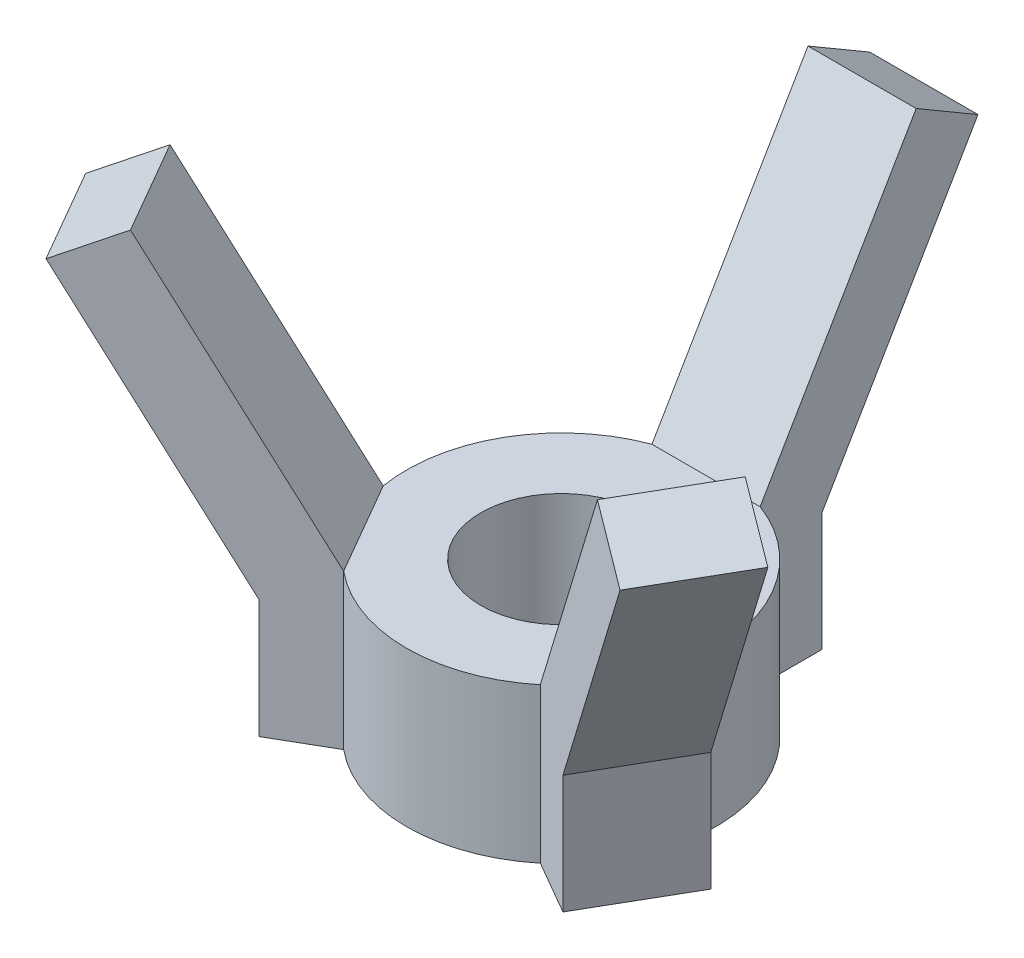
ISO-10303-21;
HEADER;
FILE_DESCRIPTION(('STEP AP214'),'2;1');
FILE_NAME('part.step','',(''),(''),'','','');
FILE_SCHEMA(('AUTOMOTIVE_DESIGN { 1 0 10303 214 1 1 1 1 }'));
ENDSEC;
DATA;
#1=APPLICATION_CONTEXT('core data for automotive mechanical design processes');
#2=APPLICATION_PROTOCOL_DEFINITION('international standard','automotive_design',2000,#1);
#3=PRODUCT_CONTEXT('',#1,'mechanical');
#4=PRODUCT('Part','Part','',(#3));
#5=PRODUCT_RELATED_PRODUCT_CATEGORY('part','',(#4));
#6=PRODUCT_DEFINITION_FORMATION('','',#4);
#7=PRODUCT_DEFINITION_CONTEXT('part definition',#1,'design');
#8=PRODUCT_DEFINITION('design','',#6,#7);
#9=PRODUCT_DEFINITION_SHAPE('','',#8);
#10=(LENGTH_UNIT() NAMED_UNIT(*) SI_UNIT(.MILLI.,.METRE.));
#11=(NAMED_UNIT(*) PLANE_ANGLE_UNIT() SI_UNIT($,.RADIAN.));
#12=(NAMED_UNIT(*) SI_UNIT($,.STERADIAN.) SOLID_ANGLE_UNIT());
#13=UNCERTAINTY_MEASURE_WITH_UNIT(LENGTH_MEASURE(1.E-05),#10,'distance_accuracy_value','');
#14=(GEOMETRIC_REPRESENTATION_CONTEXT(3) GLOBAL_UNCERTAINTY_ASSIGNED_CONTEXT((#13)) GLOBAL_UNIT_ASSIGNED_CONTEXT((#10,
#11,#12)) REPRESENTATION_CONTEXT('',''));
#15=CARTESIAN_POINT('',(0.,0.,0.));
#16=DIRECTION('',(0.,0.,1.));
#17=DIRECTION('',(1.,0.,0.));
#18=AXIS2_PLACEMENT_3D('',#15,#16,#17);
#19=CARTESIAN_POINT('',(0.,5.,0.));
#20=DIRECTION('',(0.,1.,0.));
#21=DIRECTION('',(0.,0.,1.));
#22=AXIS2_PLACEMENT_3D('',#19,#20,#21);
#23=PLANE('',#22);
#24=CARTESIAN_POINT('',(0.,5.,0.));
#25=DIRECTION('',(0.,1.,0.));
#26=DIRECTION('',(0.,0.,1.));
#27=AXIS2_PLACEMENT_3D('',#24,#25,#26);
#28=CIRCLE('',#27,2.6);
#29=CARTESIAN_POINT('',(0.,5.,2.6));
#30=VERTEX_POINT('',#29);
#31=EDGE_CURVE('E258',#30,#30,#28,.T.);
#32=ORIENTED_EDGE('',*,*,#31,.F.);
#33=EDGE_LOOP('',(#32));
#34=FACE_BOUND('',#33,.T.);
#35=CARTESIAN_POINT('',(0.,5.,0.));
#36=DIRECTION('',(0.,1.,0.));
#37=DIRECTION('',(0.,0.,1.));
#38=AXIS2_PLACEMENT_3D('',#35,#36,#37);
#39=CIRCLE('',#38,5.);
#40=CARTESIAN_POINT('',(-3.18124518489694,5.,3.85741870602221));
#41=VERTEX_POINT('',#40);
#42=CARTESIAN_POINT('',(3.18124518489694,5.,3.8574187060222));
#43=VERTEX_POINT('',#42);
#44=EDGE_CURVE('E261',#41,#43,#39,.T.);
#45=ORIENTED_EDGE('',*,*,#44,.T.);
#46=DIRECTION('',(0.499999999999995,0.,-0.866025403784441));
#47=VECTOR('',#46,1.);
#48=CARTESIAN_POINT('',(-2.85513684643813,5.,14.3127390781905));
#49=LINE('',#48,#47);
#50=CARTESIAN_POINT('',(4.931245184897,5.,0.826329792776546));
#51=VERTEX_POINT('',#50);
#52=EDGE_CURVE('E191',#43,#51,#49,.T.);
#53=ORIENTED_EDGE('',*,*,#52,.T.);
#54=CARTESIAN_POINT('',(0.,5.,0.));
#55=DIRECTION('',(0.,1.,0.));
#56=DIRECTION('',(0.,0.,1.));
#57=AXIS2_PLACEMENT_3D('',#54,#55,#56);
#58=CIRCLE('',#57,5.);
#59=CARTESIAN_POINT('',(1.75,5.,-4.6837484987988));
#60=VERTEX_POINT('',#59);
#61=EDGE_CURVE('E264',#51,#60,#58,.T.);
#62=ORIENTED_EDGE('',*,*,#61,.T.);
#63=DIRECTION('',(-1.,0.,0.));
#64=VECTOR('',#63,1.);
#65=CARTESIAN_POINT('',(13.8227640626703,5.,-4.68374849879892));
#66=LINE('',#65,#64);
#67=CARTESIAN_POINT('',(-1.7500000000001,5.,-4.68374849879876));
#68=VERTEX_POINT('',#67);
#69=EDGE_CURVE('E225',#60,#68,#66,.T.);
#70=ORIENTED_EDGE('',*,*,#69,.T.);
#71=CARTESIAN_POINT('',(0.,5.,0.));
#72=DIRECTION('',(0.,1.,0.));
#73=DIRECTION('',(0.,0.,1.));
#74=AXIS2_PLACEMENT_3D('',#71,#72,#73);
#75=CIRCLE('',#74,4.99999999999998);
#76=CARTESIAN_POINT('',(-4.93124518489694,5.,0.826329792776671));
#77=VERTEX_POINT('',#76);
#78=EDGE_CURVE('E267',#68,#77,#75,.T.);
#79=ORIENTED_EDGE('',*,*,#78,.T.);
#80=DIRECTION('',(0.500000000000001,0.,0.866025403784438));
#81=VECTOR('',#80,1.);
#82=CARTESIAN_POINT('',(-10.9676272162322,5.,-9.62899057939172));
#83=LINE('',#82,#81);
#84=EDGE_CURVE('E253',#77,#41,#83,.T.);
#85=ORIENTED_EDGE('',*,*,#84,.T.);
#86=EDGE_LOOP('',(#45,#53,#62,#70,#79,#85));
#87=FACE_BOUND('',#86,.T.);
#88=ADVANCED_FACE('F45',(#34,#87),#23,.T.);
#89=CARTESIAN_POINT('',(0.875000000000029,5.,1.51554445662282));
#90=DIRECTION('',(-0.500000000000001,0.,-0.866025403784438));
#91=DIRECTION('',(-0.866025403784438,0.,0.500000000000001));
#92=AXIS2_PLACEMENT_3D('',#89,#90,#91);
#93=PLANE('',#92);
#94=DIRECTION('',(0.437167436981779,-0.863237805816205,-0.252398737422369));
#95=VECTOR('',#94,1.);
#96=CARTESIAN_POINT('',(-9.2849703622836,12.4628336488612,7.3814060802459));
#97=LINE('',#96,#95);
#98=CARTESIAN_POINT('',(-9.2849703622836,12.4628336488612,7.3814060802459));
#99=VERTEX_POINT('',#98);
#100=CARTESIAN_POINT('',(-4.91329599246582,3.83045559069915,4.85741870602221));
#101=VERTEX_POINT('',#100);
#102=EDGE_CURVE('E231',#99,#101,#97,.T.);
#103=ORIENTED_EDGE('',*,*,#102,.T.);
#104=DIRECTION('',(0.,-1.,0.));
#105=VECTOR('',#104,1.);
#106=CARTESIAN_POINT('',(-4.91329599246582,5.,4.85741870602221));
#107=LINE('',#106,#105);
#108=CARTESIAN_POINT('',(-4.91329599246582,0.,4.85741870602221));
#109=VERTEX_POINT('',#108);
#110=EDGE_CURVE('E270',#101,#109,#107,.T.);
#111=ORIENTED_EDGE('',*,*,#110,.T.);
#112=DIRECTION('',(0.866025403784438,0.,-0.500000000000001));
#113=VECTOR('',#112,1.);
#114=CARTESIAN_POINT('',(0.875000000000029,0.,1.51554445662282));
#115=LINE('',#114,#113);
#116=CARTESIAN_POINT('',(-3.18124518489694,0.,3.85741870602221));
#117=VERTEX_POINT('',#116);
#118=EDGE_CURVE('E273',#109,#117,#115,.T.);
#119=ORIENTED_EDGE('',*,*,#118,.T.);
#120=DIRECTION('',(0.,-1.,0.));
#121=VECTOR('',#120,1.);
#122=CARTESIAN_POINT('',(-3.18124518489694,5.,3.85741870602221));
#123=LINE('',#122,#121);
#124=EDGE_CURVE('E11',#41,#117,#123,.T.);
#125=ORIENTED_EDGE('',*,*,#124,.F.);
#126=DIRECTION('',(-0.437167436981779,0.863237805816205,0.252398737422369));
#127=VECTOR('',#126,1.);
#128=CARTESIAN_POINT('',(-3.18124518489694,5.,3.85741870602221));
#129=LINE('',#128,#127);
#130=CARTESIAN_POINT('',(-7.55291955471473,13.6323780581621,6.3814060802459));
#131=VERTEX_POINT('',#130);
#132=EDGE_CURVE('E230',#41,#131,#129,.T.);
#133=ORIENTED_EDGE('',*,*,#132,.T.);
#134=DIRECTION('',(-0.747585869343971,-0.504797474844739,0.431618902908103));
#135=VECTOR('',#134,1.);
#136=CARTESIAN_POINT('',(-7.55291955471473,13.6323780581621,6.3814060802459));
#137=LINE('',#136,#135);
#138=EDGE_CURVE('E235',#131,#99,#137,.T.);
#139=ORIENTED_EDGE('',*,*,#138,.T.);
#140=EDGE_LOOP('',(#103,#111,#119,#125,#133,#139));
#141=FACE_BOUND('',#140,.T.);
#142=ADVANCED_FACE('F349',(#141),#93,.F.);
#143=CARTESIAN_POINT('',(0.,5.,0.));
#144=DIRECTION('',(0.,-1.,0.));
#145=DIRECTION('',(0.,0.,-1.));
#146=AXIS2_PLACEMENT_3D('',#143,#144,#145);
#147=CYLINDRICAL_SURFACE('',#146,5.);
#148=CARTESIAN_POINT('',(0.,0.,0.));
#149=DIRECTION('',(0.,1.,0.));
#150=DIRECTION('',(0.,0.,1.));
#151=AXIS2_PLACEMENT_3D('',#148,#149,#150);
#152=CIRCLE('',#151,5.);
#153=CARTESIAN_POINT('',(3.18124518489694,0.,3.8574187060222));
#154=VERTEX_POINT('',#153);
#155=EDGE_CURVE('E276',#117,#154,#152,.T.);
#156=ORIENTED_EDGE('',*,*,#155,.T.);
#157=DIRECTION('',(0.,-1.,0.));
#158=VECTOR('',#157,1.);
#159=CARTESIAN_POINT('',(3.18124518489694,5.,3.8574187060222));
#160=LINE('',#159,#158);
#161=EDGE_CURVE('E53',#43,#154,#160,.T.);
#162=ORIENTED_EDGE('',*,*,#161,.F.);
#163=ORIENTED_EDGE('',*,*,#44,.F.);
#164=ORIENTED_EDGE('',*,*,#124,.T.);
#165=EDGE_LOOP('',(#156,#162,#163,#164));
#166=FACE_BOUND('',#165,.T.);
#167=ADVANCED_FACE('F329',(#166),#147,.T.);
#168=CARTESIAN_POINT('',(-0.875000000000074,5.,1.5155444566231));
#169=DIRECTION('',(-0.49999999999995,0.,0.866025403784467));
#170=DIRECTION('',(0.866025403784467,0.,0.499999999999951));
#171=AXIS2_PLACEMENT_3D('',#168,#169,#170);
#172=PLANE('',#171);
#173=DIRECTION('',(0.,-1.,0.));
#174=VECTOR('',#173,1.);
#175=CARTESIAN_POINT('',(4.91329599246588,5.,4.8574187060221));
#176=LINE('',#175,#174);
#177=CARTESIAN_POINT('',(4.91329599246588,3.83045559069915,4.8574187060221));
#178=VERTEX_POINT('',#177);
#179=CARTESIAN_POINT('',(4.91329599246588,0.,4.8574187060221));
#180=VERTEX_POINT('',#179);
#181=EDGE_CURVE('E324',#178,#180,#176,.T.);
#182=ORIENTED_EDGE('',*,*,#181,.F.);
#183=DIRECTION('',(-0.437167436981781,-0.863237805816205,-0.252398737422367));
#184=VECTOR('',#183,1.);
#185=CARTESIAN_POINT('',(9.2849703622837,12.4628336488612,7.38140608024575));
#186=LINE('',#185,#184);
#187=CARTESIAN_POINT('',(9.28497036228371,12.4628336488612,7.38140608024575));
#188=VERTEX_POINT('',#187);
#189=EDGE_CURVE('E174',#188,#178,#186,.T.);
#190=ORIENTED_EDGE('',*,*,#189,.F.);
#191=DIRECTION('',(0.747585869343974,-0.504797474844739,0.431618902908099));
#192=VECTOR('',#191,1.);
#193=CARTESIAN_POINT('',(7.55291955471483,13.6323780581621,6.38140608024576));
#194=LINE('',#193,#192);
#195=CARTESIAN_POINT('',(7.55291955471482,13.6323780581621,6.38140608024577));
#196=VERTEX_POINT('',#195);
#197=EDGE_CURVE('E168',#196,#188,#194,.T.);
#198=ORIENTED_EDGE('',*,*,#197,.F.);
#199=DIRECTION('',(0.437167436981781,0.863237805816205,0.252398737422367));
#200=VECTOR('',#199,1.);
#201=CARTESIAN_POINT('',(3.18124518489702,5.,3.85741870602209));
#202=LINE('',#201,#200);
#203=EDGE_CURVE('E172',#43,#196,#202,.T.);
#204=ORIENTED_EDGE('',*,*,#203,.F.);
#205=ORIENTED_EDGE('',*,*,#161,.T.);
#206=DIRECTION('',(-0.866025403784467,0.,-0.499999999999951));
#207=VECTOR('',#206,1.);
#208=CARTESIAN_POINT('',(-0.875000000000074,0.,1.5155444566231));
#209=LINE('',#208,#207);
#210=EDGE_CURVE('E279',#180,#154,#209,.T.);
#211=ORIENTED_EDGE('',*,*,#210,.F.);
#212=EDGE_LOOP('',(#182,#190,#198,#204,#205,#211));
#213=FACE_BOUND('',#212,.T.);
#214=ADVANCED_FACE('F170',(#213),#172,.T.);
#215=CARTESIAN_POINT('',(5.78829599246585,5.,3.34187424939939));
#216=DIRECTION('',(0.866025403784439,0.,0.5));
#217=DIRECTION('',(0.5,0.,-0.866025403784439));
#218=AXIS2_PLACEMENT_3D('',#215,#216,#217);
#219=PLANE('',#218);
#220=DIRECTION('',(0.499999999999995,0.,-0.866025403784441));
#221=VECTOR('',#220,1.);
#222=CARTESIAN_POINT('',(-1.12308603886924,3.83045559069915,15.3127390781905));
#223=LINE('',#222,#221);
#224=CARTESIAN_POINT('',(6.66329599246588,3.83045559069916,1.82632979277657));
#225=VERTEX_POINT('',#224);
#226=EDGE_CURVE('E60',#178,#225,#223,.T.);
#227=ORIENTED_EDGE('',*,*,#226,.F.);
#228=ORIENTED_EDGE('',*,*,#181,.T.);
#229=DIRECTION('',(-0.5,0.,0.866025403784439));
#230=VECTOR('',#229,1.);
#231=CARTESIAN_POINT('',(5.78829599246585,0.,3.34187424939939));
#232=LINE('',#231,#230);
#233=CARTESIAN_POINT('',(6.66329599246588,0.,1.82632979277657));
#234=VERTEX_POINT('',#233);
#235=EDGE_CURVE('E282',#234,#180,#232,.T.);
#236=ORIENTED_EDGE('',*,*,#235,.F.);
#237=DIRECTION('',(0.,-1.,0.));
#238=VECTOR('',#237,1.);
#239=CARTESIAN_POINT('',(6.66329599246588,5.,1.82632979277657));
#240=LINE('',#239,#238);
#241=EDGE_CURVE('E65',#225,#234,#240,.T.);
#242=ORIENTED_EDGE('',*,*,#241,.F.);
#243=EDGE_LOOP('',(#227,#228,#236,#242));
#244=FACE_BOUND('',#243,.T.);
#245=ADVANCED_FACE('F336',(#244),#219,.T.);
#246=CARTESIAN_POINT('',(0.875000000000023,5.,-1.51554445662281));
#247=DIRECTION('',(-0.499999999999999,0.,0.866025403784439));
#248=DIRECTION('',(0.86602540378444,0.,0.499999999999999));
#249=AXIS2_PLACEMENT_3D('',#246,#247,#248);
#250=PLANE('',#249);
#251=DIRECTION('',(-0.437167436981781,-0.863237805816205,-0.252398737422366));
#252=VECTOR('',#251,1.);
#253=CARTESIAN_POINT('',(11.0349703622837,12.4628336488612,4.3503171670002));
#254=LINE('',#253,#252);
#255=CARTESIAN_POINT('',(11.0349703622837,12.4628336488612,4.3503171670002));
#256=VERTEX_POINT('',#255);
#257=EDGE_CURVE('E192',#256,#225,#254,.T.);
#258=ORIENTED_EDGE('',*,*,#257,.T.);
#259=ORIENTED_EDGE('',*,*,#241,.T.);
#260=DIRECTION('',(-0.86602540378444,0.,-0.499999999999999));
#261=VECTOR('',#260,1.);
#262=CARTESIAN_POINT('',(0.875000000000023,0.,-1.51554445662281));
#263=LINE('',#262,#261);
#264=CARTESIAN_POINT('',(4.931245184897,0.,0.826329792776571));
#265=VERTEX_POINT('',#264);
#266=EDGE_CURVE('E285',#234,#265,#263,.T.);
#267=ORIENTED_EDGE('',*,*,#266,.T.);
#268=DIRECTION('',(0.,-1.,0.));
#269=VECTOR('',#268,1.);
#270=CARTESIAN_POINT('',(4.931245184897,5.,0.826329792776571));
#271=LINE('',#270,#269);
#272=EDGE_CURVE('E320',#51,#265,#271,.T.);
#273=ORIENTED_EDGE('',*,*,#272,.F.);
#274=DIRECTION('',(0.437167436981781,0.863237805816205,0.252398737422367));
#275=VECTOR('',#274,1.);
#276=CARTESIAN_POINT('',(4.931245184897,5.,0.826329792776545));
#277=LINE('',#276,#275);
#278=CARTESIAN_POINT('',(9.30291955471481,13.6323780581621,3.35031716700021));
#279=VERTEX_POINT('',#278);
#280=EDGE_CURVE('E198',#51,#279,#277,.T.);
#281=ORIENTED_EDGE('',*,*,#280,.T.);
#282=DIRECTION('',(0.747585869343974,-0.504797474844739,0.431618902908098));
#283=VECTOR('',#282,1.);
#284=CARTESIAN_POINT('',(9.30291955471481,13.6323780581621,3.35031716700021));
#285=LINE('',#284,#283);
#286=EDGE_CURVE('E183',#279,#256,#285,.T.);
#287=ORIENTED_EDGE('',*,*,#286,.T.);
#288=EDGE_LOOP('',(#258,#259,#267,#273,#281,#287));
#289=FACE_BOUND('',#288,.T.);
#290=ADVANCED_FACE('F341',(#289),#250,.F.);
#291=CARTESIAN_POINT('',(0.,5.,0.));
#292=DIRECTION('',(0.,-1.,0.));
#293=DIRECTION('',(0.,0.,-1.));
#294=AXIS2_PLACEMENT_3D('',#291,#292,#293);
#295=CYLINDRICAL_SURFACE('',#294,5.);
#296=CARTESIAN_POINT('',(0.,0.,0.));
#297=DIRECTION('',(0.,1.,0.));
#298=DIRECTION('',(0.,0.,1.));
#299=AXIS2_PLACEMENT_3D('',#296,#297,#298);
#300=CIRCLE('',#299,5.);
#301=CARTESIAN_POINT('',(1.75,0.,-4.6837484987988));
#302=VERTEX_POINT('',#301);
#303=EDGE_CURVE('E287',#265,#302,#300,.T.);
#304=ORIENTED_EDGE('',*,*,#303,.T.);
#305=DIRECTION('',(0.,-1.,0.));
#306=VECTOR('',#305,1.);
#307=CARTESIAN_POINT('',(1.75,5.,-4.6837484987988));
#308=LINE('',#307,#306);
#309=EDGE_CURVE('E318',#60,#302,#308,.T.);
#310=ORIENTED_EDGE('',*,*,#309,.F.);
#311=ORIENTED_EDGE('',*,*,#61,.F.);
#312=ORIENTED_EDGE('',*,*,#272,.T.);
#313=EDGE_LOOP('',(#304,#310,#311,#312));
#314=FACE_BOUND('',#313,.T.);
#315=ADVANCED_FACE('F387',(#314),#295,.T.);
#316=CARTESIAN_POINT('',(1.75,5.,0.));
#317=DIRECTION('',(1.,0.,0.));
#318=DIRECTION('',(0.,0.,-1.));
#319=AXIS2_PLACEMENT_3D('',#316,#317,#318);
#320=PLANE('',#319);
#321=DIRECTION('',(0.,-1.,0.));
#322=VECTOR('',#321,1.);
#323=CARTESIAN_POINT('',(1.75,5.,-6.6837484987988));
#324=LINE('',#323,#322);
#325=CARTESIAN_POINT('',(1.74999999999988,3.83045559069915,-6.68374849879879));
#326=VERTEX_POINT('',#325);
#327=CARTESIAN_POINT('',(1.75,0.,-6.6837484987988));
#328=VERTEX_POINT('',#327);
#329=EDGE_CURVE('E316',#326,#328,#324,.T.);
#330=ORIENTED_EDGE('',*,*,#329,.F.);
#331=DIRECTION('',(0.,-0.863237805816205,0.504797474844738));
#332=VECTOR('',#331,1.);
#333=CARTESIAN_POINT('',(1.74999999999983,12.4628336488612,-11.7317232472462));
#334=LINE('',#333,#332);
#335=CARTESIAN_POINT('',(1.74999999999983,12.4628336488612,-11.7317232472462));
#336=VERTEX_POINT('',#335);
#337=EDGE_CURVE('E217',#336,#326,#334,.T.);
#338=ORIENTED_EDGE('',*,*,#337,.F.);
#339=DIRECTION('',(0.,-0.504797474844739,-0.863237805816205));
#340=VECTOR('',#339,1.);
#341=CARTESIAN_POINT('',(1.74999999999985,13.6323780581621,-9.73172324724618));
#342=LINE('',#341,#340);
#343=CARTESIAN_POINT('',(1.74999999999985,13.6323780581621,-9.73172324724618));
#344=VERTEX_POINT('',#343);
#345=EDGE_CURVE('E221',#344,#336,#342,.T.);
#346=ORIENTED_EDGE('',*,*,#345,.F.);
#347=DIRECTION('',(0.,0.863237805816205,-0.504797474844738));
#348=VECTOR('',#347,1.);
#349=CARTESIAN_POINT('',(1.7499999999999,5.,-4.6837484987988));
#350=LINE('',#349,#348);
#351=EDGE_CURVE('E208',#60,#344,#350,.T.);
#352=ORIENTED_EDGE('',*,*,#351,.F.);
#353=ORIENTED_EDGE('',*,*,#309,.T.);
#354=DIRECTION('',(0.,0.,1.));
#355=VECTOR('',#354,1.);
#356=CARTESIAN_POINT('',(1.75,0.,0.));
#357=LINE('',#356,#355);
#358=EDGE_CURVE('E290',#328,#302,#357,.T.);
#359=ORIENTED_EDGE('',*,*,#358,.F.);
#360=EDGE_LOOP('',(#330,#338,#346,#352,#353,#359));
#361=FACE_BOUND('',#360,.T.);
#362=ADVANCED_FACE('F385',(#361),#320,.T.);
#363=CARTESIAN_POINT('',(0.,5.,-6.6837484987988));
#364=DIRECTION('',(0.,0.,-1.));
#365=DIRECTION('',(-1.,0.,0.));
#366=AXIS2_PLACEMENT_3D('',#363,#364,#365);
#367=PLANE('',#366);
#368=DIRECTION('',(-1.,0.,0.));
#369=VECTOR('',#368,1.);
#370=CARTESIAN_POINT('',(13.8227640626703,3.83045559069915,-6.68374849879892));
#371=LINE('',#370,#369);
#372=CARTESIAN_POINT('',(-1.75000000000012,3.83045559069915,-6.68374849879876));
#373=VERTEX_POINT('',#372);
#374=EDGE_CURVE('E219',#326,#373,#371,.T.);
#375=ORIENTED_EDGE('',*,*,#374,.F.);
#376=ORIENTED_EDGE('',*,*,#329,.T.);
#377=DIRECTION('',(1.,0.,0.));
#378=VECTOR('',#377,1.);
#379=CARTESIAN_POINT('',(0.,0.,-6.6837484987988));
#380=LINE('',#379,#378);
#381=CARTESIAN_POINT('',(-1.75,0.,-6.6837484987988));
#382=VERTEX_POINT('',#381);
#383=EDGE_CURVE('E293',#382,#328,#380,.T.);
#384=ORIENTED_EDGE('',*,*,#383,.F.);
#385=DIRECTION('',(0.,-1.,0.));
#386=VECTOR('',#385,1.);
#387=CARTESIAN_POINT('',(-1.75,5.,-6.6837484987988));
#388=LINE('',#387,#386);
#389=EDGE_CURVE('E314',#373,#382,#388,.T.);
#390=ORIENTED_EDGE('',*,*,#389,.F.);
#391=EDGE_LOOP('',(#375,#376,#384,#390));
#392=FACE_BOUND('',#391,.T.);
#393=ADVANCED_FACE('F381',(#392),#367,.T.);
#394=CARTESIAN_POINT('',(-1.75,5.,0.));
#395=DIRECTION('',(1.,0.,0.));
#396=DIRECTION('',(0.,0.,-1.));
#397=AXIS2_PLACEMENT_3D('',#394,#395,#396);
#398=PLANE('',#397);
#399=DIRECTION('',(0.,-0.863237805816205,0.504797474844738));
#400=VECTOR('',#399,1.);
#401=CARTESIAN_POINT('',(-1.75000000000018,12.4628336488612,-11.7317232472461));
#402=LINE('',#401,#400);
#403=CARTESIAN_POINT('',(-1.75000000000018,12.4628336488612,-11.7317232472461));
#404=VERTEX_POINT('',#403);
#405=EDGE_CURVE('E205',#404,#373,#402,.T.);
#406=ORIENTED_EDGE('',*,*,#405,.T.);
#407=ORIENTED_EDGE('',*,*,#389,.T.);
#408=DIRECTION('',(0.,0.,1.));
#409=VECTOR('',#408,1.);
#410=CARTESIAN_POINT('',(-1.75,0.,0.));
#411=LINE('',#410,#409);
#412=CARTESIAN_POINT('',(-1.75,0.,-4.6837484987988));
#413=VERTEX_POINT('',#412);
#414=EDGE_CURVE('E296',#382,#413,#411,.T.);
#415=ORIENTED_EDGE('',*,*,#414,.T.);
#416=DIRECTION('',(0.,-1.,0.));
#417=VECTOR('',#416,1.);
#418=CARTESIAN_POINT('',(-1.75,5.,-4.6837484987988));
#419=LINE('',#418,#417);
#420=EDGE_CURVE('E311',#68,#413,#419,.T.);
#421=ORIENTED_EDGE('',*,*,#420,.F.);
#422=DIRECTION('',(0.,0.863237805816205,-0.504797474844738));
#423=VECTOR('',#422,1.);
#424=CARTESIAN_POINT('',(-1.7500000000001,5.,-4.68374849879876));
#425=LINE('',#424,#423);
#426=CARTESIAN_POINT('',(-1.75000000000016,13.6323780581621,-9.73172324724614));
#427=VERTEX_POINT('',#426);
#428=EDGE_CURVE('E204',#68,#427,#425,.T.);
#429=ORIENTED_EDGE('',*,*,#428,.T.);
#430=DIRECTION('',(0.,-0.504797474844739,-0.863237805816204));
#431=VECTOR('',#430,1.);
#432=CARTESIAN_POINT('',(-1.75000000000016,13.6323780581621,-9.73172324724614));
#433=LINE('',#432,#431);
#434=EDGE_CURVE('E209',#427,#404,#433,.T.);
#435=ORIENTED_EDGE('',*,*,#434,.T.);
#436=EDGE_LOOP('',(#406,#407,#415,#421,#429,#435));
#437=FACE_BOUND('',#436,.T.);
#438=ADVANCED_FACE('F376',(#437),#398,.F.);
#439=CARTESIAN_POINT('',(0.,5.,0.));
#440=DIRECTION('',(0.,-1.,0.));
#441=DIRECTION('',(0.,0.,-1.));
#442=AXIS2_PLACEMENT_3D('',#439,#440,#441);
#443=CYLINDRICAL_SURFACE('',#442,4.99999999999998);
#444=CARTESIAN_POINT('',(0.,0.,0.));
#445=DIRECTION('',(0.,1.,0.));
#446=DIRECTION('',(0.,0.,1.));
#447=AXIS2_PLACEMENT_3D('',#444,#445,#446);
#448=CIRCLE('',#447,4.99999999999998);
#449=CARTESIAN_POINT('',(-4.93124518489694,0.,0.826329792776673));
#450=VERTEX_POINT('',#449);
#451=EDGE_CURVE('E298',#413,#450,#448,.T.);
#452=ORIENTED_EDGE('',*,*,#451,.T.);
#453=DIRECTION('',(0.,-1.,0.));
#454=VECTOR('',#453,1.);
#455=CARTESIAN_POINT('',(-4.93124518489694,5.,0.826329792776673));
#456=LINE('',#455,#454);
#457=EDGE_CURVE('E309',#77,#450,#456,.T.);
#458=ORIENTED_EDGE('',*,*,#457,.F.);
#459=ORIENTED_EDGE('',*,*,#78,.F.);
#460=ORIENTED_EDGE('',*,*,#420,.T.);
#461=EDGE_LOOP('',(#452,#458,#459,#460));
#462=FACE_BOUND('',#461,.T.);
#463=ADVANCED_FACE('F372',(#462),#443,.T.);
#464=CARTESIAN_POINT('',(-0.874999999999973,5.,-1.51554445662272));
#465=DIRECTION('',(-0.500000000000001,0.,-0.866025403784438));
#466=DIRECTION('',(-0.866025403784438,0.,0.500000000000001));
#467=AXIS2_PLACEMENT_3D('',#464,#465,#466);
#468=PLANE('',#467);
#469=DIRECTION('',(0.,-1.,0.));
#470=VECTOR('',#469,1.);
#471=CARTESIAN_POINT('',(-6.66329599246582,5.,1.82632979277667));
#472=LINE('',#471,#470);
#473=CARTESIAN_POINT('',(-6.66329599246582,3.83045559069915,1.82632979277667));
#474=VERTEX_POINT('',#473);
#475=CARTESIAN_POINT('',(-6.66329599246582,0.,1.82632979277667));
#476=VERTEX_POINT('',#475);
#477=EDGE_CURVE('E307',#474,#476,#472,.T.);
#478=ORIENTED_EDGE('',*,*,#477,.F.);
#479=DIRECTION('',(0.437167436981779,-0.863237805816205,-0.252398737422369));
#480=VECTOR('',#479,1.);
#481=CARTESIAN_POINT('',(-11.0349703622836,12.4628336488612,4.35031716700036));
#482=LINE('',#481,#480);
#483=CARTESIAN_POINT('',(-11.0349703622836,12.4628336488612,4.35031716700036));
#484=VERTEX_POINT('',#483);
#485=EDGE_CURVE('E243',#484,#474,#482,.T.);
#486=ORIENTED_EDGE('',*,*,#485,.F.);
#487=DIRECTION('',(-0.747585869343971,-0.504797474844739,0.431618902908103));
#488=VECTOR('',#487,1.);
#489=CARTESIAN_POINT('',(-9.30291955471474,13.6323780581621,3.35031716700037));
#490=LINE('',#489,#488);
#491=CARTESIAN_POINT('',(-9.30291955471474,13.6323780581621,3.35031716700036));
#492=VERTEX_POINT('',#491);
#493=EDGE_CURVE('E248',#492,#484,#490,.T.);
#494=ORIENTED_EDGE('',*,*,#493,.F.);
#495=DIRECTION('',(-0.437167436981779,0.863237805816205,0.252398737422369));
#496=VECTOR('',#495,1.);
#497=CARTESIAN_POINT('',(-4.93124518489694,5.,0.826329792776671));
#498=LINE('',#497,#496);
#499=EDGE_CURVE('E234',#77,#492,#498,.T.);
#500=ORIENTED_EDGE('',*,*,#499,.F.);
#501=ORIENTED_EDGE('',*,*,#457,.T.);
#502=DIRECTION('',(0.866025403784438,0.,-0.500000000000001));
#503=VECTOR('',#502,1.);
#504=CARTESIAN_POINT('',(-0.874999999999973,0.,-1.51554445662272));
#505=LINE('',#504,#503);
#506=EDGE_CURVE('E301',#476,#450,#505,.T.);
#507=ORIENTED_EDGE('',*,*,#506,.F.);
#508=EDGE_LOOP('',(#478,#486,#494,#500,#501,#507));
#509=FACE_BOUND('',#508,.T.);
#510=ADVANCED_FACE('F367',(#509),#468,.T.);
#511=CARTESIAN_POINT('',(0.,5.,0.));
#512=DIRECTION('',(0.,-1.,0.));
#513=DIRECTION('',(0.,0.,-1.));
#514=AXIS2_PLACEMENT_3D('',#511,#512,#513);
#515=CYLINDRICAL_SURFACE('',#514,2.6);
#516=ORIENTED_EDGE('',*,*,#31,.T.);
#517=EDGE_LOOP('',(#516));
#518=FACE_BOUND('',#517,.T.);
#519=CARTESIAN_POINT('',(0.,0.,0.));
#520=DIRECTION('',(0.,1.,0.));
#521=DIRECTION('',(0.,0.,1.));
#522=AXIS2_PLACEMENT_3D('',#519,#520,#521);
#523=CIRCLE('',#522,2.6);
#524=CARTESIAN_POINT('',(0.,0.,2.6));
#525=VERTEX_POINT('',#524);
#526=EDGE_CURVE('E257',#525,#525,#523,.T.);
#527=ORIENTED_EDGE('',*,*,#526,.F.);
#528=EDGE_LOOP('',(#527));
#529=FACE_BOUND('',#528,.T.);
#530=ADVANCED_FACE('F47',(#518,#529),#515,.F.);
#531=CARTESIAN_POINT('',(-5.78829599246585,5.,3.34187424939939));
#532=DIRECTION('',(-0.866025403784439,0.,0.5));
#533=DIRECTION('',(0.5,0.,0.866025403784439));
#534=AXIS2_PLACEMENT_3D('',#531,#532,#533);
#535=PLANE('',#534);
#536=DIRECTION('',(0.500000000000001,0.,0.866025403784438));
#537=VECTOR('',#536,1.);
#538=CARTESIAN_POINT('',(-12.699678023801,3.83045559069915,-8.62899057939172));
#539=LINE('',#538,#537);
#540=EDGE_CURVE('E246',#474,#101,#539,.T.);
#541=ORIENTED_EDGE('',*,*,#540,.F.);
#542=ORIENTED_EDGE('',*,*,#477,.T.);
#543=DIRECTION('',(-0.5,0.,-0.866025403784439));
#544=VECTOR('',#543,1.);
#545=CARTESIAN_POINT('',(-5.78829599246585,0.,3.34187424939939));
#546=LINE('',#545,#544);
#547=EDGE_CURVE('E262',#109,#476,#546,.T.);
#548=ORIENTED_EDGE('',*,*,#547,.F.);
#549=ORIENTED_EDGE('',*,*,#110,.F.);
#550=EDGE_LOOP('',(#541,#542,#548,#549));
#551=FACE_BOUND('',#550,.T.);
#552=ADVANCED_FACE('F363',(#551),#535,.T.);
#553=CARTESIAN_POINT('',(0.,0.,0.));
#554=DIRECTION('',(0.,1.,0.));
#555=DIRECTION('',(0.,0.,1.));
#556=AXIS2_PLACEMENT_3D('',#553,#554,#555);
#557=PLANE('',#556);
#558=ORIENTED_EDGE('',*,*,#526,.T.);
#559=EDGE_LOOP('',(#558));
#560=FACE_BOUND('',#559,.T.);
#561=ORIENTED_EDGE('',*,*,#118,.F.);
#562=ORIENTED_EDGE('',*,*,#547,.T.);
#563=ORIENTED_EDGE('',*,*,#506,.T.);
#564=ORIENTED_EDGE('',*,*,#451,.F.);
#565=ORIENTED_EDGE('',*,*,#414,.F.);
#566=ORIENTED_EDGE('',*,*,#383,.T.);
#567=ORIENTED_EDGE('',*,*,#358,.T.);
#568=ORIENTED_EDGE('',*,*,#303,.F.);
#569=ORIENTED_EDGE('',*,*,#266,.F.);
#570=ORIENTED_EDGE('',*,*,#235,.T.);
#571=ORIENTED_EDGE('',*,*,#210,.T.);
#572=ORIENTED_EDGE('',*,*,#155,.F.);
#573=EDGE_LOOP('',(#561,#562,#563,#564,#565,#566,#567,#568,#569,#570,#571,#572));
#574=FACE_BOUND('',#573,.T.);
#575=ADVANCED_FACE('F333',(#560,#574),#557,.F.);
#576=CARTESIAN_POINT('',(-10.9676272162322,5.,-9.62899057939172));
#577=DIRECTION('',(0.747585869343971,0.504797474844738,-0.431618902908103));
#578=DIRECTION('',(-0.559607657636584,0.828757666338295,0.));
#579=AXIS2_PLACEMENT_3D('',#576,#577,#578);
#580=PLANE('',#579);
#581=ORIENTED_EDGE('',*,*,#84,.F.);
#582=ORIENTED_EDGE('',*,*,#499,.T.);
#583=DIRECTION('',(0.500000000000001,0.,0.866025403784438));
#584=VECTOR('',#583,1.);
#585=CARTESIAN_POINT('',(-15.3393015860499,13.6323780581621,-7.10500320516802));
#586=LINE('',#585,#584);
#587=EDGE_CURVE('E242',#492,#131,#586,.T.);
#588=ORIENTED_EDGE('',*,*,#587,.T.);
#589=ORIENTED_EDGE('',*,*,#132,.F.);
#590=EDGE_LOOP('',(#581,#582,#588,#589));
#591=FACE_BOUND('',#590,.T.);
#592=ADVANCED_FACE('F351',(#591),#580,.T.);
#593=CARTESIAN_POINT('',(-15.3393015860499,13.6323780581621,-7.10500320516802));
#594=DIRECTION('',(-0.43716743698178,0.863237805816205,0.25239873742237));
#595=DIRECTION('',(-0.892121751856706,-0.451795064010356,0.));
#596=AXIS2_PLACEMENT_3D('',#593,#594,#595);
#597=PLANE('',#596);
#598=ORIENTED_EDGE('',*,*,#587,.F.);
#599=ORIENTED_EDGE('',*,*,#493,.T.);
#600=DIRECTION('',(0.500000000000001,0.,0.866025403784438));
#601=VECTOR('',#600,1.);
#602=CARTESIAN_POINT('',(-17.0713523936188,12.4628336488612,-6.10500320516802));
#603=LINE('',#602,#601);
#604=EDGE_CURVE('E247',#484,#99,#603,.T.);
#605=ORIENTED_EDGE('',*,*,#604,.T.);
#606=ORIENTED_EDGE('',*,*,#138,.F.);
#607=EDGE_LOOP('',(#598,#599,#605,#606));
#608=FACE_BOUND('',#607,.T.);
#609=ADVANCED_FACE('F356',(#608),#597,.T.);
#610=CARTESIAN_POINT('',(-17.0713523936188,12.4628336488612,-6.10500320516802));
#611=DIRECTION('',(-0.747585869343971,-0.504797474844738,0.431618902908103));
#612=DIRECTION('',(0.559607657636584,-0.828757666338295,0.));
#613=AXIS2_PLACEMENT_3D('',#610,#611,#612);
#614=PLANE('',#613);
#615=ORIENTED_EDGE('',*,*,#604,.F.);
#616=ORIENTED_EDGE('',*,*,#485,.T.);
#617=ORIENTED_EDGE('',*,*,#540,.T.);
#618=ORIENTED_EDGE('',*,*,#102,.F.);
#619=EDGE_LOOP('',(#615,#616,#617,#618));
#620=FACE_BOUND('',#619,.T.);
#621=ADVANCED_FACE('F360',(#620),#614,.T.);
#622=CARTESIAN_POINT('',(13.8227640626703,13.6323780581621,-9.7317232472463));
#623=DIRECTION('',(0.,0.863237805816205,-0.504797474844739));
#624=DIRECTION('',(0.446060875928346,-0.451795064010356,-0.772600100376589));
#625=AXIS2_PLACEMENT_3D('',#622,#623,#624);
#626=PLANE('',#625);
#627=DIRECTION('',(-1.,0.,0.));
#628=VECTOR('',#627,1.);
#629=CARTESIAN_POINT('',(13.8227640626703,13.6323780581621,-9.7317232472463));
#630=LINE('',#629,#628);
#631=EDGE_CURVE('E216',#344,#427,#630,.T.);
#632=ORIENTED_EDGE('',*,*,#631,.F.);
#633=ORIENTED_EDGE('',*,*,#345,.T.);
#634=DIRECTION('',(-1.,0.,0.));
#635=VECTOR('',#634,1.);
#636=CARTESIAN_POINT('',(13.8227640626702,12.4628336488612,-11.7317232472463));
#637=LINE('',#636,#635);
#638=EDGE_CURVE('E220',#336,#404,#637,.T.);
#639=ORIENTED_EDGE('',*,*,#638,.T.);
#640=ORIENTED_EDGE('',*,*,#434,.F.);
#641=EDGE_LOOP('',(#632,#633,#639,#640));
#642=FACE_BOUND('',#641,.T.);
#643=ADVANCED_FACE('F431',(#642),#626,.T.);
#644=CARTESIAN_POINT('',(13.8227640626703,5.,-4.68374849879892));
#645=DIRECTION('',(0.,0.504797474844738,0.863237805816205));
#646=DIRECTION('',(0.279803828818287,0.828757666338295,-0.484634447665589));
#647=AXIS2_PLACEMENT_3D('',#644,#645,#646);
#648=PLANE('',#647);
#649=ORIENTED_EDGE('',*,*,#69,.F.);
#650=ORIENTED_EDGE('',*,*,#351,.T.);
#651=ORIENTED_EDGE('',*,*,#631,.T.);
#652=ORIENTED_EDGE('',*,*,#428,.F.);
#653=EDGE_LOOP('',(#649,#650,#651,#652));
#654=FACE_BOUND('',#653,.T.);
#655=ADVANCED_FACE('F433',(#654),#648,.T.);
#656=CARTESIAN_POINT('',(13.8227640626702,12.4628336488612,-11.7317232472463));
#657=DIRECTION('',(0.,-0.504797474844738,-0.863237805816205));
#658=DIRECTION('',(-0.279803828818287,-0.828757666338295,0.484634447665589));
#659=AXIS2_PLACEMENT_3D('',#656,#657,#658);
#660=PLANE('',#659);
#661=ORIENTED_EDGE('',*,*,#638,.F.);
#662=ORIENTED_EDGE('',*,*,#337,.T.);
#663=ORIENTED_EDGE('',*,*,#374,.T.);
#664=ORIENTED_EDGE('',*,*,#405,.F.);
#665=EDGE_LOOP('',(#661,#662,#663,#664));
#666=FACE_BOUND('',#665,.T.);
#667=ADVANCED_FACE('F440',(#666),#660,.T.);
#668=CARTESIAN_POINT('',(-2.85513684643813,5.,14.3127390781905));
#669=DIRECTION('',(-0.747585869343974,0.504797474844738,-0.431618902908098));
#670=DIRECTION('',(0.279803828818294,0.828757666338295,0.484634447665585));
#671=AXIS2_PLACEMENT_3D('',#668,#669,#670);
#672=PLANE('',#671);
#673=ORIENTED_EDGE('',*,*,#52,.F.);
#674=ORIENTED_EDGE('',*,*,#203,.T.);
#675=DIRECTION('',(0.499999999999995,0.,-0.866025403784441));
#676=VECTOR('',#675,1.);
#677=CARTESIAN_POINT('',(1.51653752337968,13.6323780581621,16.8367264524142));
#678=LINE('',#677,#676);
#679=EDGE_CURVE('E178',#196,#279,#678,.T.);
#680=ORIENTED_EDGE('',*,*,#679,.T.);
#681=ORIENTED_EDGE('',*,*,#280,.F.);
#682=EDGE_LOOP('',(#673,#674,#680,#681));
#683=FACE_BOUND('',#682,.T.);
#684=ADVANCED_FACE('F189',(#683),#672,.T.);
#685=CARTESIAN_POINT('',(1.51653752337968,13.6323780581621,16.8367264524142));
#686=DIRECTION('',(0.437167436981781,0.863237805816205,0.252398737422367));
#687=DIRECTION('',(0.446060875928357,-0.451795064010356,0.772600100376583));
#688=AXIS2_PLACEMENT_3D('',#685,#686,#687);
#689=PLANE('',#688);
#690=ORIENTED_EDGE('',*,*,#679,.F.);
#691=ORIENTED_EDGE('',*,*,#197,.T.);
#692=DIRECTION('',(0.499999999999995,0.,-0.866025403784441));
#693=VECTOR('',#692,1.);
#694=CARTESIAN_POINT('',(3.24858833094856,12.4628336488612,17.8367264524142));
#695=LINE('',#694,#693);
#696=EDGE_CURVE('E177',#188,#256,#695,.T.);
#697=ORIENTED_EDGE('',*,*,#696,.T.);
#698=ORIENTED_EDGE('',*,*,#286,.F.);
#699=EDGE_LOOP('',(#690,#691,#697,#698));
#700=FACE_BOUND('',#699,.T.);
#701=ADVANCED_FACE('F181',(#700),#689,.T.);
#702=CARTESIAN_POINT('',(3.24858833094856,12.4628336488612,17.8367264524142));
#703=DIRECTION('',(0.747585869343974,-0.504797474844738,0.431618902908098));
#704=DIRECTION('',(-0.279803828818294,-0.828757666338295,-0.484634447665585));
#705=AXIS2_PLACEMENT_3D('',#702,#703,#704);
#706=PLANE('',#705);
#707=ORIENTED_EDGE('',*,*,#696,.F.);
#708=ORIENTED_EDGE('',*,*,#189,.T.);
#709=ORIENTED_EDGE('',*,*,#226,.T.);
#710=ORIENTED_EDGE('',*,*,#257,.F.);
#711=EDGE_LOOP('',(#707,#708,#709,#710));
#712=FACE_BOUND('',#711,.T.);
#713=ADVANCED_FACE('F338',(#712),#706,.T.);
#714=CLOSED_SHELL('',(#88,#142,#167,#214,#245,#290,#315,#362,#393,#438,#463,#510,#530,#552,#575,
#592,#609,#621,#643,#655,#667,#684,#701,#713));
#715=MANIFOLD_SOLID_BREP('B2',#714);
#716=ADVANCED_BREP_SHAPE_REPRESENTATION('',(#18,#715),#14);
#717=SHAPE_DEFINITION_REPRESENTATION(#9,#716);
ENDSEC;
END-ISO-10303-21;
